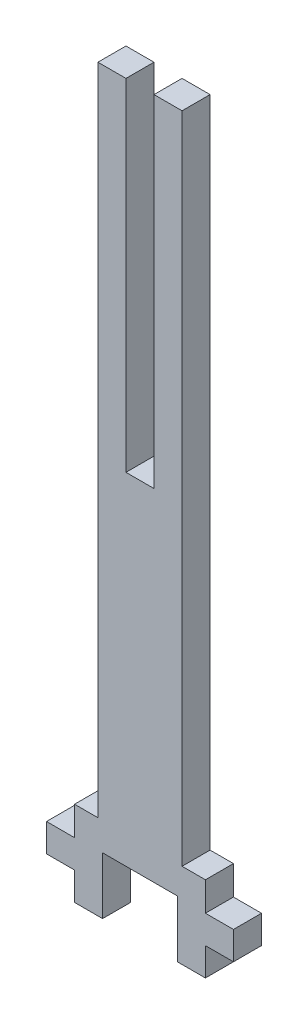
ISO-10303-21;
HEADER;
FILE_DESCRIPTION(('STEP AP214'),'2;1');
FILE_NAME('part.step','',(''),(''),'','','');
FILE_SCHEMA(('AUTOMOTIVE_DESIGN { 1 0 10303 214 1 1 1 1 }'));
ENDSEC;
DATA;
#1=APPLICATION_CONTEXT('core data for automotive mechanical design processes');
#2=APPLICATION_PROTOCOL_DEFINITION('international standard','automotive_design',2000,#1);
#3=PRODUCT_CONTEXT('',#1,'mechanical');
#4=PRODUCT('Part','Part','',(#3));
#5=PRODUCT_RELATED_PRODUCT_CATEGORY('part','',(#4));
#6=PRODUCT_DEFINITION_FORMATION('','',#4);
#7=PRODUCT_DEFINITION_CONTEXT('part definition',#1,'design');
#8=PRODUCT_DEFINITION('design','',#6,#7);
#9=PRODUCT_DEFINITION_SHAPE('','',#8);
#10=(LENGTH_UNIT() NAMED_UNIT(*) SI_UNIT(.MILLI.,.METRE.));
#11=(NAMED_UNIT(*) PLANE_ANGLE_UNIT() SI_UNIT($,.RADIAN.));
#12=(NAMED_UNIT(*) SI_UNIT($,.STERADIAN.) SOLID_ANGLE_UNIT());
#13=UNCERTAINTY_MEASURE_WITH_UNIT(LENGTH_MEASURE(1.E-05),#10,'distance_accuracy_value','');
#14=(GEOMETRIC_REPRESENTATION_CONTEXT(3) GLOBAL_UNCERTAINTY_ASSIGNED_CONTEXT((#13)) GLOBAL_UNIT_ASSIGNED_CONTEXT((#10,
#11,#12)) REPRESENTATION_CONTEXT('',''));
#15=CARTESIAN_POINT('',(0.,0.,0.));
#16=DIRECTION('',(0.,0.,1.));
#17=DIRECTION('',(1.,0.,0.));
#18=AXIS2_PLACEMENT_3D('',#15,#16,#17);
#19=CARTESIAN_POINT('',(7.,0.,3.));
#20=DIRECTION('',(-1.,0.,0.));
#21=DIRECTION('',(0.,0.,1.));
#22=AXIS2_PLACEMENT_3D('',#19,#20,#21);
#23=PLANE('',#22);
#24=DIRECTION('',(0.,0.,1.));
#25=VECTOR('',#24,1.);
#26=CARTESIAN_POINT('',(7.,-33.545999937,0.));
#27=LINE('',#26,#25);
#28=CARTESIAN_POINT('',(7.,-33.545999937,0.));
#29=VERTEX_POINT('',#28);
#30=CARTESIAN_POINT('',(7.,-33.545999937,3.));
#31=VERTEX_POINT('',#30);
#32=EDGE_CURVE('E205',#29,#31,#27,.T.);
#33=ORIENTED_EDGE('',*,*,#32,.F.);
#34=DIRECTION('',(0.,1.,0.));
#35=VECTOR('',#34,1.);
#36=CARTESIAN_POINT('',(7.,0.,0.));
#37=LINE('',#36,#35);
#38=CARTESIAN_POINT('',(7.,-30.445999937,0.));
#39=VERTEX_POINT('',#38);
#40=EDGE_CURVE('E268',#29,#39,#37,.T.);
#41=ORIENTED_EDGE('',*,*,#40,.T.);
#42=DIRECTION('',(0.,0.,-1.));
#43=VECTOR('',#42,1.);
#44=CARTESIAN_POINT('',(7.,-30.445999937,3.));
#45=LINE('',#44,#43);
#46=CARTESIAN_POINT('',(7.,-30.445999937,3.));
#47=VERTEX_POINT('',#46);
#48=EDGE_CURVE('E227',#47,#39,#45,.T.);
#49=ORIENTED_EDGE('',*,*,#48,.F.);
#50=DIRECTION('',(0.,1.,0.));
#51=VECTOR('',#50,1.);
#52=CARTESIAN_POINT('',(7.,0.,3.));
#53=LINE('',#52,#51);
#54=EDGE_CURVE('E220',#31,#47,#53,.T.);
#55=ORIENTED_EDGE('',*,*,#54,.F.);
#56=EDGE_LOOP('',(#33,#41,#49,#55));
#57=FACE_BOUND('',#56,.T.);
#58=ADVANCED_FACE('F45',(#57),#23,.F.);
#59=CARTESIAN_POINT('',(-7.,0.,3.));
#60=DIRECTION('',(1.,0.,0.));
#61=DIRECTION('',(0.,0.,-1.));
#62=AXIS2_PLACEMENT_3D('',#59,#60,#61);
#63=PLANE('',#62);
#64=DIRECTION('',(0.,0.,1.));
#65=VECTOR('',#64,1.);
#66=CARTESIAN_POINT('',(-7.,-36.545999937,0.));
#67=LINE('',#66,#65);
#68=CARTESIAN_POINT('',(-7.,-36.545999937,0.));
#69=VERTEX_POINT('',#68);
#70=CARTESIAN_POINT('',(-7.,-36.545999937,3.));
#71=VERTEX_POINT('',#70);
#72=EDGE_CURVE('E345',#69,#71,#67,.T.);
#73=ORIENTED_EDGE('',*,*,#72,.F.);
#74=DIRECTION('',(0.,-1.,0.));
#75=VECTOR('',#74,1.);
#76=CARTESIAN_POINT('',(-7.,0.,0.));
#77=LINE('',#76,#75);
#78=CARTESIAN_POINT('',(-7.,-39.545999937,0.));
#79=VERTEX_POINT('',#78);
#80=EDGE_CURVE('E252',#69,#79,#77,.T.);
#81=ORIENTED_EDGE('',*,*,#80,.T.);
#82=DIRECTION('',(0.,0.,-1.));
#83=VECTOR('',#82,1.);
#84=CARTESIAN_POINT('',(-7.,-39.545999937,3.));
#85=LINE('',#84,#83);
#86=CARTESIAN_POINT('',(-7.,-39.545999937,3.));
#87=VERTEX_POINT('',#86);
#88=EDGE_CURVE('E297',#87,#79,#85,.T.);
#89=ORIENTED_EDGE('',*,*,#88,.F.);
#90=DIRECTION('',(0.,-1.,0.));
#91=VECTOR('',#90,1.);
#92=CARTESIAN_POINT('',(-7.,0.,3.));
#93=LINE('',#92,#91);
#94=EDGE_CURVE('E360',#71,#87,#93,.T.);
#95=ORIENTED_EDGE('',*,*,#94,.F.);
#96=EDGE_LOOP('',(#73,#81,#89,#95));
#97=FACE_BOUND('',#96,.T.);
#98=ADVANCED_FACE('F454',(#97),#63,.F.);
#99=CARTESIAN_POINT('',(0.,39.545999937,3.));
#100=DIRECTION('',(0.,1.,0.));
#101=DIRECTION('',(0.,0.,1.));
#102=AXIS2_PLACEMENT_3D('',#99,#100,#101);
#103=PLANE('',#102);
#104=DIRECTION('',(0.,0.,1.));
#105=VECTOR('',#104,1.);
#106=CARTESIAN_POINT('',(1.5,39.545999937,-36.6190935360435));
#107=LINE('',#106,#105);
#108=CARTESIAN_POINT('',(1.5,39.545999937,0.));
#109=VERTEX_POINT('',#108);
#110=CARTESIAN_POINT('',(1.5,39.545999937,3.));
#111=VERTEX_POINT('',#110);
#112=EDGE_CURVE('E350',#109,#111,#107,.T.);
#113=ORIENTED_EDGE('',*,*,#112,.T.);
#114=DIRECTION('',(1.,0.,0.));
#115=VECTOR('',#114,1.);
#116=CARTESIAN_POINT('',(0.,39.545999937,3.));
#117=LINE('',#116,#115);
#118=CARTESIAN_POINT('',(4.5,39.545999937,3.));
#119=VERTEX_POINT('',#118);
#120=EDGE_CURVE('E278',#111,#119,#117,.T.);
#121=ORIENTED_EDGE('',*,*,#120,.T.);
#122=DIRECTION('',(0.,0.,-1.));
#123=VECTOR('',#122,1.);
#124=CARTESIAN_POINT('',(4.5,39.545999937,3.));
#125=LINE('',#124,#123);
#126=CARTESIAN_POINT('',(4.5,39.545999937,0.));
#127=VERTEX_POINT('',#126);
#128=EDGE_CURVE('E242',#119,#127,#125,.T.);
#129=ORIENTED_EDGE('',*,*,#128,.T.);
#130=DIRECTION('',(1.,0.,0.));
#131=VECTOR('',#130,1.);
#132=CARTESIAN_POINT('',(0.,39.545999937,0.));
#133=LINE('',#132,#131);
#134=EDGE_CURVE('E247',#109,#127,#133,.T.);
#135=ORIENTED_EDGE('',*,*,#134,.F.);
#136=EDGE_LOOP('',(#113,#121,#129,#135));
#137=FACE_BOUND('',#136,.T.);
#138=ADVANCED_FACE('F434',(#137),#103,.T.);
#139=DIRECTION('',(0.,0.,1.));
#140=VECTOR('',#139,1.);
#141=CARTESIAN_POINT('',(-1.5,39.545999937,-36.6190935360435));
#142=LINE('',#141,#140);
#143=CARTESIAN_POINT('',(-1.5,39.545999937,0.));
#144=VERTEX_POINT('',#143);
#145=CARTESIAN_POINT('',(-1.5,39.545999937,3.));
#146=VERTEX_POINT('',#145);
#147=EDGE_CURVE('E324',#144,#146,#142,.T.);
#148=ORIENTED_EDGE('',*,*,#147,.F.);
#149=CARTESIAN_POINT('',(-4.5,39.545999937,0.));
#150=VERTEX_POINT('',#149);
#151=EDGE_CURVE('E243',#150,#144,#133,.T.);
#152=ORIENTED_EDGE('',*,*,#151,.F.);
#153=DIRECTION('',(0.,0.,-1.));
#154=VECTOR('',#153,1.);
#155=CARTESIAN_POINT('',(-4.5,39.545999937,3.));
#156=LINE('',#155,#154);
#157=CARTESIAN_POINT('',(-4.5,39.545999937,3.));
#158=VERTEX_POINT('',#157);
#159=EDGE_CURVE('E11',#158,#150,#156,.T.);
#160=ORIENTED_EDGE('',*,*,#159,.F.);
#161=EDGE_CURVE('E356',#158,#146,#117,.T.);
#162=ORIENTED_EDGE('',*,*,#161,.T.);
#163=EDGE_LOOP('',(#148,#152,#160,#162));
#164=FACE_BOUND('',#163,.T.);
#165=ADVANCED_FACE('F47',(#164),#103,.T.);
#166=CARTESIAN_POINT('',(-4.5,0.,3.));
#167=DIRECTION('',(-1.,0.,0.));
#168=DIRECTION('',(0.,0.,1.));
#169=AXIS2_PLACEMENT_3D('',#166,#167,#168);
#170=PLANE('',#169);
#171=DIRECTION('',(0.,1.,0.));
#172=VECTOR('',#171,1.);
#173=CARTESIAN_POINT('',(-4.5,0.,0.));
#174=LINE('',#173,#172);
#175=CARTESIAN_POINT('',(-4.5,-30.445999937,0.));
#176=VERTEX_POINT('',#175);
#177=EDGE_CURVE('E246',#176,#150,#174,.T.);
#178=ORIENTED_EDGE('',*,*,#177,.F.);
#179=DIRECTION('',(0.,0.,-1.));
#180=VECTOR('',#179,1.);
#181=CARTESIAN_POINT('',(-4.5,-30.445999937,3.));
#182=LINE('',#181,#180);
#183=CARTESIAN_POINT('',(-4.5,-30.445999937,3.));
#184=VERTEX_POINT('',#183);
#185=EDGE_CURVE('E53',#184,#176,#182,.T.);
#186=ORIENTED_EDGE('',*,*,#185,.F.);
#187=DIRECTION('',(0.,1.,0.));
#188=VECTOR('',#187,1.);
#189=CARTESIAN_POINT('',(-4.5,0.,3.));
#190=LINE('',#189,#188);
#191=EDGE_CURVE('E319',#184,#158,#190,.T.);
#192=ORIENTED_EDGE('',*,*,#191,.T.);
#193=ORIENTED_EDGE('',*,*,#159,.T.);
#194=EDGE_LOOP('',(#178,#186,#192,#193));
#195=FACE_BOUND('',#194,.T.);
#196=ADVANCED_FACE('F317',(#195),#170,.T.);
#197=CARTESIAN_POINT('',(0.,-30.445999937,3.));
#198=DIRECTION('',(0.,-1.,0.));
#199=DIRECTION('',(1.,0.,0.));
#200=AXIS2_PLACEMENT_3D('',#197,#198,#199);
#201=PLANE('',#200);
#202=DIRECTION('',(-1.,0.,0.));
#203=VECTOR('',#202,1.);
#204=CARTESIAN_POINT('',(0.,-30.445999937,0.));
#205=LINE('',#204,#203);
#206=CARTESIAN_POINT('',(-7.,-30.445999937,0.));
#207=VERTEX_POINT('',#206);
#208=EDGE_CURVE('E250',#176,#207,#205,.T.);
#209=ORIENTED_EDGE('',*,*,#208,.T.);
#210=DIRECTION('',(0.,0.,-1.));
#211=VECTOR('',#210,1.);
#212=CARTESIAN_POINT('',(-7.,-30.445999937,3.));
#213=LINE('',#212,#211);
#214=CARTESIAN_POINT('',(-7.,-30.445999937,3.));
#215=VERTEX_POINT('',#214);
#216=EDGE_CURVE('E300',#215,#207,#213,.T.);
#217=ORIENTED_EDGE('',*,*,#216,.F.);
#218=DIRECTION('',(-1.,0.,0.));
#219=VECTOR('',#218,1.);
#220=CARTESIAN_POINT('',(0.,-30.445999937,3.));
#221=LINE('',#220,#219);
#222=EDGE_CURVE('E307',#184,#215,#221,.T.);
#223=ORIENTED_EDGE('',*,*,#222,.F.);
#224=ORIENTED_EDGE('',*,*,#185,.T.);
#225=EDGE_LOOP('',(#209,#217,#223,#224));
#226=FACE_BOUND('',#225,.T.);
#227=ADVANCED_FACE('F305',(#226),#201,.F.);
#228=CARTESIAN_POINT('',(-7.,-33.545999937,0.));
#229=VERTEX_POINT('',#228);
#230=EDGE_CURVE('E253',#207,#229,#77,.T.);
#231=ORIENTED_EDGE('',*,*,#230,.T.);
#232=DIRECTION('',(0.,0.,1.));
#233=VECTOR('',#232,1.);
#234=CARTESIAN_POINT('',(-7.,-33.545999937,0.));
#235=LINE('',#234,#233);
#236=CARTESIAN_POINT('',(-7.,-33.545999937,3.));
#237=VERTEX_POINT('',#236);
#238=EDGE_CURVE('E338',#229,#237,#235,.T.);
#239=ORIENTED_EDGE('',*,*,#238,.T.);
#240=EDGE_CURVE('E361',#215,#237,#93,.T.);
#241=ORIENTED_EDGE('',*,*,#240,.F.);
#242=ORIENTED_EDGE('',*,*,#216,.T.);
#243=EDGE_LOOP('',(#231,#239,#241,#242));
#244=FACE_BOUND('',#243,.T.);
#245=ADVANCED_FACE('F423',(#244),#63,.F.);
#246=CARTESIAN_POINT('',(0.,-39.545999937,3.));
#247=DIRECTION('',(0.,1.,0.));
#248=DIRECTION('',(0.,0.,1.));
#249=AXIS2_PLACEMENT_3D('',#246,#247,#248);
#250=PLANE('',#249);
#251=DIRECTION('',(1.,0.,0.));
#252=VECTOR('',#251,1.);
#253=CARTESIAN_POINT('',(0.,-39.545999937,0.));
#254=LINE('',#253,#252);
#255=CARTESIAN_POINT('',(-4.,-39.545999937,0.));
#256=VERTEX_POINT('',#255);
#257=EDGE_CURVE('E256',#79,#256,#254,.T.);
#258=ORIENTED_EDGE('',*,*,#257,.T.);
#259=DIRECTION('',(0.,0.,-1.));
#260=VECTOR('',#259,1.);
#261=CARTESIAN_POINT('',(-4.,-39.545999937,3.));
#262=LINE('',#261,#260);
#263=CARTESIAN_POINT('',(-4.,-39.545999937,3.));
#264=VERTEX_POINT('',#263);
#265=EDGE_CURVE('E294',#264,#256,#262,.T.);
#266=ORIENTED_EDGE('',*,*,#265,.F.);
#267=DIRECTION('',(1.,0.,0.));
#268=VECTOR('',#267,1.);
#269=CARTESIAN_POINT('',(0.,-39.545999937,3.));
#270=LINE('',#269,#268);
#271=EDGE_CURVE('E364',#87,#264,#270,.T.);
#272=ORIENTED_EDGE('',*,*,#271,.F.);
#273=ORIENTED_EDGE('',*,*,#88,.T.);
#274=EDGE_LOOP('',(#258,#266,#272,#273));
#275=FACE_BOUND('',#274,.T.);
#276=ADVANCED_FACE('F470',(#275),#250,.F.);
#277=CARTESIAN_POINT('',(-4.,0.,3.));
#278=DIRECTION('',(-1.,0.,0.));
#279=DIRECTION('',(0.,0.,1.));
#280=AXIS2_PLACEMENT_3D('',#277,#278,#279);
#281=PLANE('',#280);
#282=DIRECTION('',(0.,1.,0.));
#283=VECTOR('',#282,1.);
#284=CARTESIAN_POINT('',(-4.,0.,0.));
#285=LINE('',#284,#283);
#286=CARTESIAN_POINT('',(-4.,-33.445999937,0.));
#287=VERTEX_POINT('',#286);
#288=EDGE_CURVE('E258',#256,#287,#285,.T.);
#289=ORIENTED_EDGE('',*,*,#288,.T.);
#290=DIRECTION('',(0.,0.,-1.));
#291=VECTOR('',#290,1.);
#292=CARTESIAN_POINT('',(-4.,-33.445999937,3.));
#293=LINE('',#292,#291);
#294=CARTESIAN_POINT('',(-4.,-33.445999937,3.));
#295=VERTEX_POINT('',#294);
#296=EDGE_CURVE('E291',#295,#287,#293,.T.);
#297=ORIENTED_EDGE('',*,*,#296,.F.);
#298=DIRECTION('',(0.,1.,0.));
#299=VECTOR('',#298,1.);
#300=CARTESIAN_POINT('',(-4.,0.,3.));
#301=LINE('',#300,#299);
#302=EDGE_CURVE('E366',#264,#295,#301,.T.);
#303=ORIENTED_EDGE('',*,*,#302,.F.);
#304=ORIENTED_EDGE('',*,*,#265,.T.);
#305=EDGE_LOOP('',(#289,#297,#303,#304));
#306=FACE_BOUND('',#305,.T.);
#307=ADVANCED_FACE('F467',(#306),#281,.F.);
#308=CARTESIAN_POINT('',(0.,-33.445999937,3.));
#309=DIRECTION('',(0.,1.,0.));
#310=DIRECTION('',(0.,0.,1.));
#311=AXIS2_PLACEMENT_3D('',#308,#309,#310);
#312=PLANE('',#311);
#313=DIRECTION('',(1.,0.,0.));
#314=VECTOR('',#313,1.);
#315=CARTESIAN_POINT('',(0.,-33.445999937,0.));
#316=LINE('',#315,#314);
#317=CARTESIAN_POINT('',(4.,-33.445999937,0.));
#318=VERTEX_POINT('',#317);
#319=EDGE_CURVE('E260',#287,#318,#316,.T.);
#320=ORIENTED_EDGE('',*,*,#319,.T.);
#321=DIRECTION('',(0.,0.,-1.));
#322=VECTOR('',#321,1.);
#323=CARTESIAN_POINT('',(4.,-33.445999937,3.));
#324=LINE('',#323,#322);
#325=CARTESIAN_POINT('',(4.,-33.445999937,3.));
#326=VERTEX_POINT('',#325);
#327=EDGE_CURVE('E289',#326,#318,#324,.T.);
#328=ORIENTED_EDGE('',*,*,#327,.F.);
#329=DIRECTION('',(1.,0.,0.));
#330=VECTOR('',#329,1.);
#331=CARTESIAN_POINT('',(0.,-33.445999937,3.));
#332=LINE('',#331,#330);
#333=EDGE_CURVE('E368',#295,#326,#332,.T.);
#334=ORIENTED_EDGE('',*,*,#333,.F.);
#335=ORIENTED_EDGE('',*,*,#296,.T.);
#336=EDGE_LOOP('',(#320,#328,#334,#335));
#337=FACE_BOUND('',#336,.T.);
#338=ADVANCED_FACE('F381',(#337),#312,.F.);
#339=CARTESIAN_POINT('',(4.,0.,3.));
#340=DIRECTION('',(-1.,0.,0.));
#341=DIRECTION('',(0.,0.,1.));
#342=AXIS2_PLACEMENT_3D('',#339,#340,#341);
#343=PLANE('',#342);
#344=DIRECTION('',(0.,1.,0.));
#345=VECTOR('',#344,1.);
#346=CARTESIAN_POINT('',(4.,0.,0.));
#347=LINE('',#346,#345);
#348=CARTESIAN_POINT('',(4.,-39.545999937,0.));
#349=VERTEX_POINT('',#348);
#350=EDGE_CURVE('E263',#349,#318,#347,.T.);
#351=ORIENTED_EDGE('',*,*,#350,.F.);
#352=DIRECTION('',(0.,0.,-1.));
#353=VECTOR('',#352,1.);
#354=CARTESIAN_POINT('',(4.,-39.545999937,3.));
#355=LINE('',#354,#353);
#356=CARTESIAN_POINT('',(4.,-39.545999937,3.));
#357=VERTEX_POINT('',#356);
#358=EDGE_CURVE('E287',#357,#349,#355,.T.);
#359=ORIENTED_EDGE('',*,*,#358,.F.);
#360=DIRECTION('',(0.,1.,0.));
#361=VECTOR('',#360,1.);
#362=CARTESIAN_POINT('',(4.,0.,3.));
#363=LINE('',#362,#361);
#364=EDGE_CURVE('E234',#357,#326,#363,.T.);
#365=ORIENTED_EDGE('',*,*,#364,.T.);
#366=ORIENTED_EDGE('',*,*,#327,.T.);
#367=EDGE_LOOP('',(#351,#359,#365,#366));
#368=FACE_BOUND('',#367,.T.);
#369=ADVANCED_FACE('F373',(#368),#343,.T.);
#370=CARTESIAN_POINT('',(0.,-39.545999937,3.));
#371=DIRECTION('',(0.,1.,0.));
#372=DIRECTION('',(0.,0.,1.));
#373=AXIS2_PLACEMENT_3D('',#370,#371,#372);
#374=PLANE('',#373);
#375=DIRECTION('',(1.,0.,0.));
#376=VECTOR('',#375,1.);
#377=CARTESIAN_POINT('',(0.,-39.545999937,0.));
#378=LINE('',#377,#376);
#379=CARTESIAN_POINT('',(7.,-39.545999937,0.));
#380=VERTEX_POINT('',#379);
#381=EDGE_CURVE('E266',#349,#380,#378,.T.);
#382=ORIENTED_EDGE('',*,*,#381,.T.);
#383=DIRECTION('',(0.,0.,-1.));
#384=VECTOR('',#383,1.);
#385=CARTESIAN_POINT('',(7.,-39.545999937,3.));
#386=LINE('',#385,#384);
#387=CARTESIAN_POINT('',(7.,-39.545999937,3.));
#388=VERTEX_POINT('',#387);
#389=EDGE_CURVE('E284',#388,#380,#386,.T.);
#390=ORIENTED_EDGE('',*,*,#389,.F.);
#391=DIRECTION('',(1.,0.,0.));
#392=VECTOR('',#391,1.);
#393=CARTESIAN_POINT('',(0.,-39.545999937,3.));
#394=LINE('',#393,#392);
#395=EDGE_CURVE('E230',#357,#388,#394,.T.);
#396=ORIENTED_EDGE('',*,*,#395,.F.);
#397=ORIENTED_EDGE('',*,*,#358,.T.);
#398=EDGE_LOOP('',(#382,#390,#396,#397));
#399=FACE_BOUND('',#398,.T.);
#400=ADVANCED_FACE('F388',(#399),#374,.F.);
#401=CARTESIAN_POINT('',(7.,-36.545999937,0.));
#402=VERTEX_POINT('',#401);
#403=EDGE_CURVE('E269',#380,#402,#37,.T.);
#404=ORIENTED_EDGE('',*,*,#403,.T.);
#405=DIRECTION('',(0.,0.,1.));
#406=VECTOR('',#405,1.);
#407=CARTESIAN_POINT('',(7.,-36.545999937,0.));
#408=LINE('',#407,#406);
#409=CARTESIAN_POINT('',(7.,-36.545999937,3.));
#410=VERTEX_POINT('',#409);
#411=EDGE_CURVE('E392',#402,#410,#408,.T.);
#412=ORIENTED_EDGE('',*,*,#411,.T.);
#413=EDGE_CURVE('E229',#388,#410,#53,.T.);
#414=ORIENTED_EDGE('',*,*,#413,.F.);
#415=ORIENTED_EDGE('',*,*,#389,.T.);
#416=EDGE_LOOP('',(#404,#412,#414,#415));
#417=FACE_BOUND('',#416,.T.);
#418=ADVANCED_FACE('F391',(#417),#23,.F.);
#419=CARTESIAN_POINT('',(0.,-30.445999937,3.));
#420=DIRECTION('',(0.,-1.,0.));
#421=DIRECTION('',(0.,0.,-1.));
#422=AXIS2_PLACEMENT_3D('',#419,#420,#421);
#423=PLANE('',#422);
#424=DIRECTION('',(-1.,0.,0.));
#425=VECTOR('',#424,1.);
#426=CARTESIAN_POINT('',(0.,-30.445999937,0.));
#427=LINE('',#426,#425);
#428=CARTESIAN_POINT('',(4.5,-30.445999937,0.));
#429=VERTEX_POINT('',#428);
#430=EDGE_CURVE('E272',#39,#429,#427,.T.);
#431=ORIENTED_EDGE('',*,*,#430,.T.);
#432=DIRECTION('',(0.,0.,-1.));
#433=VECTOR('',#432,1.);
#434=CARTESIAN_POINT('',(4.5,-30.445999937,3.));
#435=LINE('',#434,#433);
#436=CARTESIAN_POINT('',(4.5,-30.445999937,3.));
#437=VERTEX_POINT('',#436);
#438=EDGE_CURVE('E281',#437,#429,#435,.T.);
#439=ORIENTED_EDGE('',*,*,#438,.F.);
#440=DIRECTION('',(-1.,0.,0.));
#441=VECTOR('',#440,1.);
#442=CARTESIAN_POINT('',(0.,-30.445999937,3.));
#443=LINE('',#442,#441);
#444=EDGE_CURVE('E233',#47,#437,#443,.T.);
#445=ORIENTED_EDGE('',*,*,#444,.F.);
#446=ORIENTED_EDGE('',*,*,#48,.T.);
#447=EDGE_LOOP('',(#431,#439,#445,#446));
#448=FACE_BOUND('',#447,.T.);
#449=ADVANCED_FACE('F444',(#448),#423,.F.);
#450=CARTESIAN_POINT('',(4.5,0.,3.));
#451=DIRECTION('',(1.,0.,0.));
#452=DIRECTION('',(0.,0.,-1.));
#453=AXIS2_PLACEMENT_3D('',#450,#451,#452);
#454=PLANE('',#453);
#455=DIRECTION('',(0.,-1.,0.));
#456=VECTOR('',#455,1.);
#457=CARTESIAN_POINT('',(4.5,0.,0.));
#458=LINE('',#457,#456);
#459=EDGE_CURVE('E275',#127,#429,#458,.T.);
#460=ORIENTED_EDGE('',*,*,#459,.F.);
#461=ORIENTED_EDGE('',*,*,#128,.F.);
#462=DIRECTION('',(0.,-1.,0.));
#463=VECTOR('',#462,1.);
#464=CARTESIAN_POINT('',(4.5,0.,3.));
#465=LINE('',#464,#463);
#466=EDGE_CURVE('E239',#119,#437,#465,.T.);
#467=ORIENTED_EDGE('',*,*,#466,.T.);
#468=ORIENTED_EDGE('',*,*,#438,.T.);
#469=EDGE_LOOP('',(#460,#461,#467,#468));
#470=FACE_BOUND('',#469,.T.);
#471=ADVANCED_FACE('F440',(#470),#454,.T.);
#472=CARTESIAN_POINT('',(0.,0.,3.));
#473=DIRECTION('',(0.,0.,1.));
#474=DIRECTION('',(1.,0.,0.));
#475=AXIS2_PLACEMENT_3D('',#472,#473,#474);
#476=PLANE('',#475);
#477=DIRECTION('',(0.,1.,0.));
#478=VECTOR('',#477,1.);
#479=CARTESIAN_POINT('',(1.5,39.545999937,3.));
#480=LINE('',#479,#478);
#481=CARTESIAN_POINT('',(1.5,3.05,3.));
#482=VERTEX_POINT('',#481);
#483=EDGE_CURVE('E342',#482,#111,#480,.T.);
#484=ORIENTED_EDGE('',*,*,#483,.F.);
#485=DIRECTION('',(1.,0.,0.));
#486=VECTOR('',#485,1.);
#487=CARTESIAN_POINT('',(-1.5,3.05,3.));
#488=LINE('',#487,#486);
#489=CARTESIAN_POINT('',(-1.5,3.05,3.));
#490=VERTEX_POINT('',#489);
#491=EDGE_CURVE('E348',#490,#482,#488,.T.);
#492=ORIENTED_EDGE('',*,*,#491,.F.);
#493=DIRECTION('',(0.,-1.,0.));
#494=VECTOR('',#493,1.);
#495=CARTESIAN_POINT('',(-1.5,39.545999937,3.));
#496=LINE('',#495,#494);
#497=EDGE_CURVE('E344',#146,#490,#496,.T.);
#498=ORIENTED_EDGE('',*,*,#497,.F.);
#499=ORIENTED_EDGE('',*,*,#161,.F.);
#500=ORIENTED_EDGE('',*,*,#191,.F.);
#501=ORIENTED_EDGE('',*,*,#222,.T.);
#502=ORIENTED_EDGE('',*,*,#240,.T.);
#503=DIRECTION('',(-1.,0.,0.));
#504=VECTOR('',#503,1.);
#505=CARTESIAN_POINT('',(-7.,-33.545999937,3.));
#506=LINE('',#505,#504);
#507=CARTESIAN_POINT('',(-10.,-33.545999937,3.));
#508=VERTEX_POINT('',#507);
#509=EDGE_CURVE('E68',#237,#508,#506,.T.);
#510=ORIENTED_EDGE('',*,*,#509,.T.);
#511=DIRECTION('',(0.,-1.,0.));
#512=VECTOR('',#511,1.);
#513=CARTESIAN_POINT('',(-10.,-36.545999937,3.));
#514=LINE('',#513,#512);
#515=CARTESIAN_POINT('',(-10.,-36.545999937,3.));
#516=VERTEX_POINT('',#515);
#517=EDGE_CURVE('E394',#508,#516,#514,.T.);
#518=ORIENTED_EDGE('',*,*,#517,.T.);
#519=DIRECTION('',(1.,0.,0.));
#520=VECTOR('',#519,1.);
#521=CARTESIAN_POINT('',(-7.,-36.545999937,3.));
#522=LINE('',#521,#520);
#523=EDGE_CURVE('E408',#516,#71,#522,.T.);
#524=ORIENTED_EDGE('',*,*,#523,.T.);
#525=ORIENTED_EDGE('',*,*,#94,.T.);
#526=ORIENTED_EDGE('',*,*,#271,.T.);
#527=ORIENTED_EDGE('',*,*,#302,.T.);
#528=ORIENTED_EDGE('',*,*,#333,.T.);
#529=ORIENTED_EDGE('',*,*,#364,.F.);
#530=ORIENTED_EDGE('',*,*,#395,.T.);
#531=ORIENTED_EDGE('',*,*,#413,.T.);
#532=DIRECTION('',(1.,0.,0.));
#533=VECTOR('',#532,1.);
#534=CARTESIAN_POINT('',(7.,-36.545999937,3.));
#535=LINE('',#534,#533);
#536=CARTESIAN_POINT('',(10.,-36.545999937,3.));
#537=VERTEX_POINT('',#536);
#538=EDGE_CURVE('E60',#410,#537,#535,.T.);
#539=ORIENTED_EDGE('',*,*,#538,.T.);
#540=DIRECTION('',(0.,1.,0.));
#541=VECTOR('',#540,1.);
#542=CARTESIAN_POINT('',(10.,-36.545999937,3.));
#543=LINE('',#542,#541);
#544=CARTESIAN_POINT('',(10.,-33.545999937,3.));
#545=VERTEX_POINT('',#544);
#546=EDGE_CURVE('E223',#537,#545,#543,.T.);
#547=ORIENTED_EDGE('',*,*,#546,.T.);
#548=DIRECTION('',(-1.,0.,0.));
#549=VECTOR('',#548,1.);
#550=CARTESIAN_POINT('',(7.,-33.545999937,3.));
#551=LINE('',#550,#549);
#552=EDGE_CURVE('E208',#545,#31,#551,.T.);
#553=ORIENTED_EDGE('',*,*,#552,.T.);
#554=ORIENTED_EDGE('',*,*,#54,.T.);
#555=ORIENTED_EDGE('',*,*,#444,.T.);
#556=ORIENTED_EDGE('',*,*,#466,.F.);
#557=ORIENTED_EDGE('',*,*,#120,.F.);
#558=EDGE_LOOP('',(#484,#492,#498,#499,#500,#501,#502,#510,#518,#524,#525,#526,#527,#528,#529,
#530,#531,#539,#547,#553,#554,#555,#556,#557));
#559=FACE_BOUND('',#558,.T.);
#560=ADVANCED_FACE('F219',(#559),#476,.T.);
#561=CARTESIAN_POINT('',(0.,0.,0.));
#562=DIRECTION('',(0.,0.,1.));
#563=DIRECTION('',(1.,0.,0.));
#564=AXIS2_PLACEMENT_3D('',#561,#562,#563);
#565=PLANE('',#564);
#566=DIRECTION('',(-1.,0.,0.));
#567=VECTOR('',#566,1.);
#568=CARTESIAN_POINT('',(-1.5,3.05,0.));
#569=LINE('',#568,#567);
#570=CARTESIAN_POINT('',(1.5,3.05,0.));
#571=VERTEX_POINT('',#570);
#572=CARTESIAN_POINT('',(-1.5,3.05,0.));
#573=VERTEX_POINT('',#572);
#574=EDGE_CURVE('E329',#571,#573,#569,.T.);
#575=ORIENTED_EDGE('',*,*,#574,.F.);
#576=DIRECTION('',(0.,-1.,0.));
#577=VECTOR('',#576,1.);
#578=CARTESIAN_POINT('',(1.5,39.545999937,0.));
#579=LINE('',#578,#577);
#580=EDGE_CURVE('E333',#109,#571,#579,.T.);
#581=ORIENTED_EDGE('',*,*,#580,.F.);
#582=ORIENTED_EDGE('',*,*,#134,.T.);
#583=ORIENTED_EDGE('',*,*,#459,.T.);
#584=ORIENTED_EDGE('',*,*,#430,.F.);
#585=ORIENTED_EDGE('',*,*,#40,.F.);
#586=DIRECTION('',(-1.,0.,0.));
#587=VECTOR('',#586,1.);
#588=CARTESIAN_POINT('',(7.,-33.545999937,0.));
#589=LINE('',#588,#587);
#590=CARTESIAN_POINT('',(10.,-33.545999937,0.));
#591=VERTEX_POINT('',#590);
#592=EDGE_CURVE('E210',#591,#29,#589,.T.);
#593=ORIENTED_EDGE('',*,*,#592,.F.);
#594=DIRECTION('',(0.,1.,0.));
#595=VECTOR('',#594,1.);
#596=CARTESIAN_POINT('',(10.,-36.545999937,0.));
#597=LINE('',#596,#595);
#598=CARTESIAN_POINT('',(10.,-36.545999937,0.));
#599=VERTEX_POINT('',#598);
#600=EDGE_CURVE('E399',#599,#591,#597,.T.);
#601=ORIENTED_EDGE('',*,*,#600,.F.);
#602=DIRECTION('',(1.,0.,0.));
#603=VECTOR('',#602,1.);
#604=CARTESIAN_POINT('',(7.,-36.545999937,0.));
#605=LINE('',#604,#603);
#606=EDGE_CURVE('E224',#402,#599,#605,.T.);
#607=ORIENTED_EDGE('',*,*,#606,.F.);
#608=ORIENTED_EDGE('',*,*,#403,.F.);
#609=ORIENTED_EDGE('',*,*,#381,.F.);
#610=ORIENTED_EDGE('',*,*,#350,.T.);
#611=ORIENTED_EDGE('',*,*,#319,.F.);
#612=ORIENTED_EDGE('',*,*,#288,.F.);
#613=ORIENTED_EDGE('',*,*,#257,.F.);
#614=ORIENTED_EDGE('',*,*,#80,.F.);
#615=DIRECTION('',(1.,0.,0.));
#616=VECTOR('',#615,1.);
#617=CARTESIAN_POINT('',(-7.,-36.545999937,0.));
#618=LINE('',#617,#616);
#619=CARTESIAN_POINT('',(-10.,-36.545999937,0.));
#620=VERTEX_POINT('',#619);
#621=EDGE_CURVE('E411',#620,#69,#618,.T.);
#622=ORIENTED_EDGE('',*,*,#621,.F.);
#623=DIRECTION('',(0.,-1.,0.));
#624=VECTOR('',#623,1.);
#625=CARTESIAN_POINT('',(-10.,-36.545999937,0.));
#626=LINE('',#625,#624);
#627=CARTESIAN_POINT('',(-10.,-33.545999937,0.));
#628=VERTEX_POINT('',#627);
#629=EDGE_CURVE('E407',#628,#620,#626,.T.);
#630=ORIENTED_EDGE('',*,*,#629,.F.);
#631=DIRECTION('',(-1.,0.,0.));
#632=VECTOR('',#631,1.);
#633=CARTESIAN_POINT('',(-7.,-33.545999937,0.));
#634=LINE('',#633,#632);
#635=EDGE_CURVE('E404',#229,#628,#634,.T.);
#636=ORIENTED_EDGE('',*,*,#635,.F.);
#637=ORIENTED_EDGE('',*,*,#230,.F.);
#638=ORIENTED_EDGE('',*,*,#208,.F.);
#639=ORIENTED_EDGE('',*,*,#177,.T.);
#640=ORIENTED_EDGE('',*,*,#151,.T.);
#641=DIRECTION('',(0.,1.,0.));
#642=VECTOR('',#641,1.);
#643=CARTESIAN_POINT('',(-1.5,39.545999937,0.));
#644=LINE('',#643,#642);
#645=EDGE_CURVE('E326',#573,#144,#644,.T.);
#646=ORIENTED_EDGE('',*,*,#645,.F.);
#647=EDGE_LOOP('',(#575,#581,#582,#583,#584,#585,#593,#601,#607,#608,#609,#610,#611,#612,#613,
#614,#622,#630,#636,#637,#638,#639,#640,#646));
#648=FACE_BOUND('',#647,.T.);
#649=ADVANCED_FACE('F315',(#648),#565,.F.);
#650=CARTESIAN_POINT('',(1.5,39.545999937,-36.6190935360435));
#651=DIRECTION('',(1.,0.,0.));
#652=DIRECTION('',(0.,1.,0.));
#653=AXIS2_PLACEMENT_3D('',#650,#651,#652);
#654=PLANE('',#653);
#655=ORIENTED_EDGE('',*,*,#580,.T.);
#656=DIRECTION('',(0.,0.,1.));
#657=VECTOR('',#656,1.);
#658=CARTESIAN_POINT('',(1.5,3.05,-36.6190935360435));
#659=LINE('',#658,#657);
#660=EDGE_CURVE('E331',#571,#482,#659,.T.);
#661=ORIENTED_EDGE('',*,*,#660,.T.);
#662=ORIENTED_EDGE('',*,*,#483,.T.);
#663=ORIENTED_EDGE('',*,*,#112,.F.);
#664=EDGE_LOOP('',(#655,#661,#662,#663));
#665=FACE_BOUND('',#664,.T.);
#666=ADVANCED_FACE('F431',(#665),#654,.F.);
#667=CARTESIAN_POINT('',(-1.5,3.05,-36.6190935360435));
#668=DIRECTION('',(0.,-1.,0.));
#669=DIRECTION('',(1.,0.,0.));
#670=AXIS2_PLACEMENT_3D('',#667,#668,#669);
#671=PLANE('',#670);
#672=ORIENTED_EDGE('',*,*,#574,.T.);
#673=DIRECTION('',(0.,0.,1.));
#674=VECTOR('',#673,1.);
#675=CARTESIAN_POINT('',(-1.5,3.05,-36.6190935360435));
#676=LINE('',#675,#674);
#677=EDGE_CURVE('E335',#573,#490,#676,.T.);
#678=ORIENTED_EDGE('',*,*,#677,.T.);
#679=ORIENTED_EDGE('',*,*,#491,.T.);
#680=ORIENTED_EDGE('',*,*,#660,.F.);
#681=EDGE_LOOP('',(#672,#678,#679,#680));
#682=FACE_BOUND('',#681,.T.);
#683=ADVANCED_FACE('F429',(#682),#671,.F.);
#684=CARTESIAN_POINT('',(-1.5,39.545999937,-36.6190935360435));
#685=DIRECTION('',(-1.,0.,0.));
#686=DIRECTION('',(0.,-1.,0.));
#687=AXIS2_PLACEMENT_3D('',#684,#685,#686);
#688=PLANE('',#687);
#689=ORIENTED_EDGE('',*,*,#645,.T.);
#690=ORIENTED_EDGE('',*,*,#147,.T.);
#691=ORIENTED_EDGE('',*,*,#497,.T.);
#692=ORIENTED_EDGE('',*,*,#677,.F.);
#693=EDGE_LOOP('',(#689,#690,#691,#692));
#694=FACE_BOUND('',#693,.T.);
#695=ADVANCED_FACE('F426',(#694),#688,.F.);
#696=CARTESIAN_POINT('',(-7.,-36.545999937,0.));
#697=DIRECTION('',(0.,-1.,0.));
#698=DIRECTION('',(0.,0.,-1.));
#699=AXIS2_PLACEMENT_3D('',#696,#697,#698);
#700=PLANE('',#699);
#701=ORIENTED_EDGE('',*,*,#523,.F.);
#702=DIRECTION('',(0.,0.,1.));
#703=VECTOR('',#702,1.);
#704=CARTESIAN_POINT('',(-10.,-36.545999937,0.));
#705=LINE('',#704,#703);
#706=EDGE_CURVE('E418',#620,#516,#705,.T.);
#707=ORIENTED_EDGE('',*,*,#706,.F.);
#708=ORIENTED_EDGE('',*,*,#621,.T.);
#709=ORIENTED_EDGE('',*,*,#72,.T.);
#710=EDGE_LOOP('',(#701,#707,#708,#709));
#711=FACE_BOUND('',#710,.T.);
#712=ADVANCED_FACE('F509',(#711),#700,.T.);
#713=CARTESIAN_POINT('',(-10.,-36.545999937,0.));
#714=DIRECTION('',(-1.,0.,0.));
#715=DIRECTION('',(0.,0.,1.));
#716=AXIS2_PLACEMENT_3D('',#713,#714,#715);
#717=PLANE('',#716);
#718=ORIENTED_EDGE('',*,*,#517,.F.);
#719=DIRECTION('',(0.,0.,1.));
#720=VECTOR('',#719,1.);
#721=CARTESIAN_POINT('',(-10.,-33.545999937,0.));
#722=LINE('',#721,#720);
#723=EDGE_CURVE('E419',#628,#508,#722,.T.);
#724=ORIENTED_EDGE('',*,*,#723,.F.);
#725=ORIENTED_EDGE('',*,*,#629,.T.);
#726=ORIENTED_EDGE('',*,*,#706,.T.);
#727=EDGE_LOOP('',(#718,#724,#725,#726));
#728=FACE_BOUND('',#727,.T.);
#729=ADVANCED_FACE('F682',(#728),#717,.T.);
#730=CARTESIAN_POINT('',(-7.,-33.545999937,0.));
#731=DIRECTION('',(0.,1.,0.));
#732=DIRECTION('',(0.,0.,1.));
#733=AXIS2_PLACEMENT_3D('',#730,#731,#732);
#734=PLANE('',#733);
#735=ORIENTED_EDGE('',*,*,#509,.F.);
#736=ORIENTED_EDGE('',*,*,#238,.F.);
#737=ORIENTED_EDGE('',*,*,#635,.T.);
#738=ORIENTED_EDGE('',*,*,#723,.T.);
#739=EDGE_LOOP('',(#735,#736,#737,#738));
#740=FACE_BOUND('',#739,.T.);
#741=ADVANCED_FACE('F694',(#740),#734,.T.);
#742=CARTESIAN_POINT('',(7.,-33.545999937,0.));
#743=DIRECTION('',(0.,1.,0.));
#744=DIRECTION('',(0.,0.,1.));
#745=AXIS2_PLACEMENT_3D('',#742,#743,#744);
#746=PLANE('',#745);
#747=ORIENTED_EDGE('',*,*,#552,.F.);
#748=DIRECTION('',(0.,0.,1.));
#749=VECTOR('',#748,1.);
#750=CARTESIAN_POINT('',(10.,-33.545999937,0.));
#751=LINE('',#750,#749);
#752=EDGE_CURVE('E214',#591,#545,#751,.T.);
#753=ORIENTED_EDGE('',*,*,#752,.F.);
#754=ORIENTED_EDGE('',*,*,#592,.T.);
#755=ORIENTED_EDGE('',*,*,#32,.T.);
#756=EDGE_LOOP('',(#747,#753,#754,#755));
#757=FACE_BOUND('',#756,.T.);
#758=ADVANCED_FACE('F207',(#757),#746,.T.);
#759=CARTESIAN_POINT('',(10.,-36.545999937,0.));
#760=DIRECTION('',(1.,0.,0.));
#761=DIRECTION('',(0.,0.,-1.));
#762=AXIS2_PLACEMENT_3D('',#759,#760,#761);
#763=PLANE('',#762);
#764=ORIENTED_EDGE('',*,*,#546,.F.);
#765=DIRECTION('',(0.,0.,1.));
#766=VECTOR('',#765,1.);
#767=CARTESIAN_POINT('',(10.,-36.545999937,0.));
#768=LINE('',#767,#766);
#769=EDGE_CURVE('E771',#599,#537,#768,.T.);
#770=ORIENTED_EDGE('',*,*,#769,.F.);
#771=ORIENTED_EDGE('',*,*,#600,.T.);
#772=ORIENTED_EDGE('',*,*,#752,.T.);
#773=EDGE_LOOP('',(#764,#770,#771,#772));
#774=FACE_BOUND('',#773,.T.);
#775=ADVANCED_FACE('F716',(#774),#763,.T.);
#776=CARTESIAN_POINT('',(7.,-36.545999937,0.));
#777=DIRECTION('',(0.,-1.,0.));
#778=DIRECTION('',(0.,0.,-1.));
#779=AXIS2_PLACEMENT_3D('',#776,#777,#778);
#780=PLANE('',#779);
#781=ORIENTED_EDGE('',*,*,#538,.F.);
#782=ORIENTED_EDGE('',*,*,#411,.F.);
#783=ORIENTED_EDGE('',*,*,#606,.T.);
#784=ORIENTED_EDGE('',*,*,#769,.T.);
#785=EDGE_LOOP('',(#781,#782,#783,#784));
#786=FACE_BOUND('',#785,.T.);
#787=ADVANCED_FACE('F727',(#786),#780,.T.);
#788=CLOSED_SHELL('',(#58,#98,#138,#165,#196,#227,#245,#276,#307,#338,#369,#400,#418,#449,#471,
#560,#649,#666,#683,#695,#712,#729,#741,#758,#775,#787));
#789=MANIFOLD_SOLID_BREP('B2',#788);
#790=ADVANCED_BREP_SHAPE_REPRESENTATION('',(#18,#789),#14);
#791=SHAPE_DEFINITION_REPRESENTATION(#9,#790);
ENDSEC;
END-ISO-10303-21;
